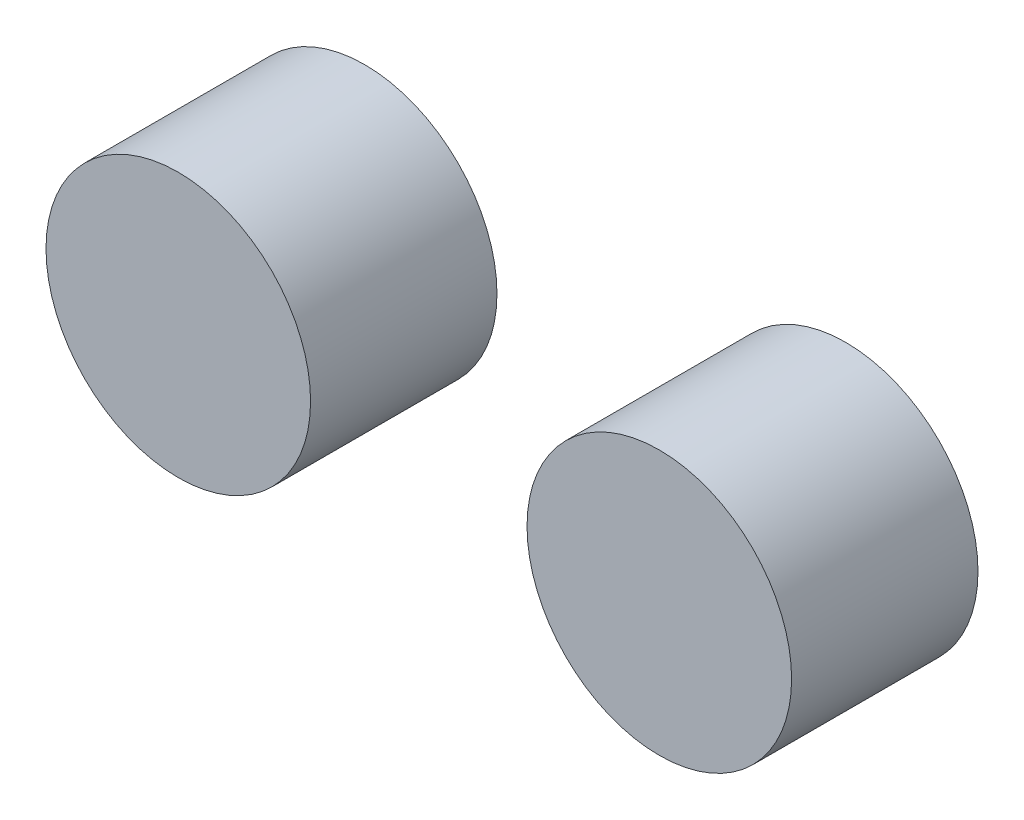
ISO-10303-21;
HEADER;
FILE_DESCRIPTION(('STEP AP214'),'2;1');
FILE_NAME('part.step','',(''),(''),'','','');
FILE_SCHEMA(('AUTOMOTIVE_DESIGN { 1 0 10303 214 1 1 1 1 }'));
ENDSEC;
DATA;
#1=APPLICATION_CONTEXT('core data for automotive mechanical design processes');
#2=APPLICATION_PROTOCOL_DEFINITION('international standard','automotive_design',2000,#1);
#3=PRODUCT_CONTEXT('',#1,'mechanical');
#4=PRODUCT('Part','Part','',(#3));
#5=PRODUCT_RELATED_PRODUCT_CATEGORY('part','',(#4));
#6=PRODUCT_DEFINITION_FORMATION('','',#4);
#7=PRODUCT_DEFINITION_CONTEXT('part definition',#1,'design');
#8=PRODUCT_DEFINITION('design','',#6,#7);
#9=PRODUCT_DEFINITION_SHAPE('','',#8);
#10=(LENGTH_UNIT() NAMED_UNIT(*) SI_UNIT(.MILLI.,.METRE.));
#11=(NAMED_UNIT(*) PLANE_ANGLE_UNIT() SI_UNIT($,.RADIAN.));
#12=(NAMED_UNIT(*) SI_UNIT($,.STERADIAN.) SOLID_ANGLE_UNIT());
#13=UNCERTAINTY_MEASURE_WITH_UNIT(LENGTH_MEASURE(1.E-05),#10,'distance_accuracy_value','');
#14=(GEOMETRIC_REPRESENTATION_CONTEXT(3) GLOBAL_UNCERTAINTY_ASSIGNED_CONTEXT((#13)) GLOBAL_UNIT_ASSIGNED_CONTEXT((#10,
#11,#12)) REPRESENTATION_CONTEXT('',''));
#15=CARTESIAN_POINT('',(0.,0.,0.));
#16=DIRECTION('',(0.,0.,1.));
#17=DIRECTION('',(1.,0.,0.));
#18=AXIS2_PLACEMENT_3D('',#15,#16,#17);
#19=CARTESIAN_POINT('',(20.,60.,17.1));
#20=DIRECTION('',(0.,0.,-1.));
#21=DIRECTION('',(-1.,0.,0.));
#22=AXIS2_PLACEMENT_3D('',#19,#20,#21);
#23=CYLINDRICAL_SURFACE('',#22,11.);
#24=CARTESIAN_POINT('',(20.,60.,17.1));
#25=DIRECTION('',(0.,0.,1.));
#26=DIRECTION('',(1.,0.,0.));
#27=AXIS2_PLACEMENT_3D('',#24,#25,#26);
#28=CIRCLE('',#27,11.);
#29=CARTESIAN_POINT('',(31.,60.,17.1));
#30=VERTEX_POINT('',#29);
#31=EDGE_CURVE('E51',#30,#30,#28,.T.);
#32=ORIENTED_EDGE('',*,*,#31,.F.);
#33=EDGE_LOOP('',(#32));
#34=FACE_BOUND('',#33,.T.);
#35=CARTESIAN_POINT('',(20.,60.,1.6));
#36=DIRECTION('',(0.,0.,1.));
#37=DIRECTION('',(1.,0.,0.));
#38=AXIS2_PLACEMENT_3D('',#35,#36,#37);
#39=CIRCLE('',#38,11.);
#40=CARTESIAN_POINT('',(31.,60.,1.6));
#41=VERTEX_POINT('',#40);
#42=EDGE_CURVE('E11',#41,#41,#39,.T.);
#43=ORIENTED_EDGE('',*,*,#42,.T.);
#44=EDGE_LOOP('',(#43));
#45=FACE_BOUND('',#44,.T.);
#46=ADVANCED_FACE('F50',(#34,#45),#23,.T.);
#47=CARTESIAN_POINT('',(20.,60.,17.1));
#48=DIRECTION('',(0.,0.,1.));
#49=DIRECTION('',(1.,0.,0.));
#50=AXIS2_PLACEMENT_3D('',#47,#48,#49);
#51=PLANE('',#50);
#52=ORIENTED_EDGE('',*,*,#31,.T.);
#53=EDGE_LOOP('',(#52));
#54=FACE_BOUND('',#53,.T.);
#55=ADVANCED_FACE('F47',(#54),#51,.T.);
#56=CARTESIAN_POINT('',(20.,60.,1.6));
#57=DIRECTION('',(0.,0.,1.));
#58=DIRECTION('',(1.,0.,0.));
#59=AXIS2_PLACEMENT_3D('',#56,#57,#58);
#60=PLANE('',#59);
#61=ORIENTED_EDGE('',*,*,#42,.F.);
#62=EDGE_LOOP('',(#61));
#63=FACE_BOUND('',#62,.T.);
#64=ADVANCED_FACE('F68',(#63),#60,.F.);
#65=CLOSED_SHELL('',(#46,#55,#64));
#66=MANIFOLD_SOLID_BREP('B2',#65);
#67=CARTESIAN_POINT('',(-20.,60.,17.1));
#68=DIRECTION('',(0.,0.,-1.));
#69=DIRECTION('',(-1.,0.,0.));
#70=AXIS2_PLACEMENT_3D('',#67,#68,#69);
#71=CYLINDRICAL_SURFACE('',#70,11.);
#72=CARTESIAN_POINT('',(-20.,60.,17.1));
#73=DIRECTION('',(0.,0.,1.));
#74=DIRECTION('',(1.,0.,0.));
#75=AXIS2_PLACEMENT_3D('',#72,#73,#74);
#76=CIRCLE('',#75,11.);
#77=CARTESIAN_POINT('',(-9.,60.,17.1));
#78=VERTEX_POINT('',#77);
#79=EDGE_CURVE('E46',#78,#78,#76,.T.);
#80=ORIENTED_EDGE('',*,*,#79,.F.);
#81=EDGE_LOOP('',(#80));
#82=FACE_BOUND('',#81,.T.);
#83=CARTESIAN_POINT('',(-20.,60.,1.6));
#84=DIRECTION('',(0.,0.,1.));
#85=DIRECTION('',(1.,0.,0.));
#86=AXIS2_PLACEMENT_3D('',#83,#84,#85);
#87=CIRCLE('',#86,11.);
#88=CARTESIAN_POINT('',(-9.,60.,1.6));
#89=VERTEX_POINT('',#88);
#90=EDGE_CURVE('E91',#89,#89,#87,.T.);
#91=ORIENTED_EDGE('',*,*,#90,.T.);
#92=EDGE_LOOP('',(#91));
#93=FACE_BOUND('',#92,.T.);
#94=ADVANCED_FACE('F86',(#82,#93),#71,.T.);
#95=CARTESIAN_POINT('',(-20.,60.,17.1));
#96=DIRECTION('',(0.,0.,1.));
#97=DIRECTION('',(1.,0.,0.));
#98=AXIS2_PLACEMENT_3D('',#95,#96,#97);
#99=PLANE('',#98);
#100=ORIENTED_EDGE('',*,*,#79,.T.);
#101=EDGE_LOOP('',(#100));
#102=FACE_BOUND('',#101,.T.);
#103=ADVANCED_FACE('F101',(#102),#99,.T.);
#104=CARTESIAN_POINT('',(-20.,60.,1.6));
#105=DIRECTION('',(0.,0.,1.));
#106=DIRECTION('',(1.,0.,0.));
#107=AXIS2_PLACEMENT_3D('',#104,#105,#106);
#108=PLANE('',#107);
#109=ORIENTED_EDGE('',*,*,#90,.F.);
#110=EDGE_LOOP('',(#109));
#111=FACE_BOUND('',#110,.T.);
#112=ADVANCED_FACE('F103',(#111),#108,.F.);
#113=CLOSED_SHELL('',(#94,#103,#112));
#114=MANIFOLD_SOLID_BREP('B6',#113);
#115=ADVANCED_BREP_SHAPE_REPRESENTATION('',(#18,#66,#114),#14);
#116=SHAPE_DEFINITION_REPRESENTATION(#9,#115);
ENDSEC;
END-ISO-10303-21;
